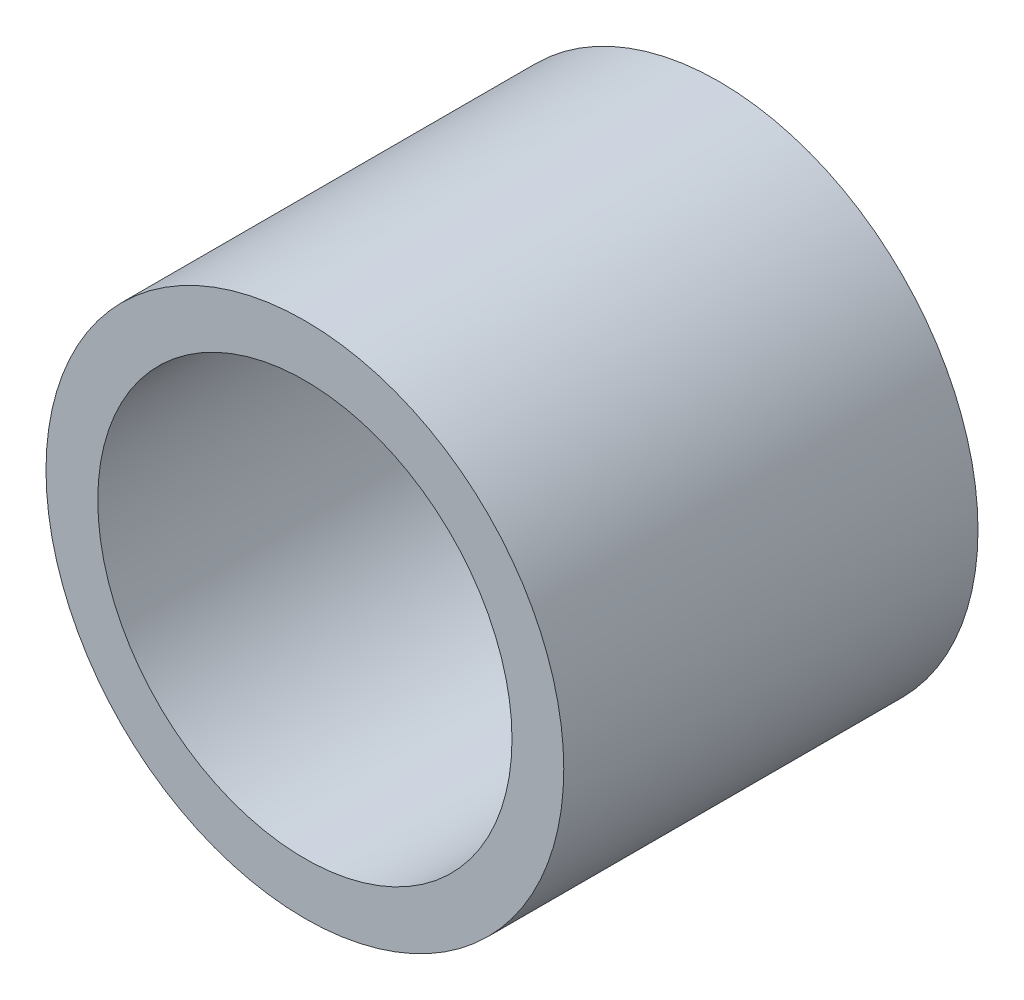
ISO-10303-21;
HEADER;
FILE_DESCRIPTION(('STEP AP214'),'2;1');
FILE_NAME('part.step','',(''),(''),'','','');
FILE_SCHEMA(('AUTOMOTIVE_DESIGN { 1 0 10303 214 1 1 1 1 }'));
ENDSEC;
DATA;
#1=APPLICATION_CONTEXT('core data for automotive mechanical design processes');
#2=APPLICATION_PROTOCOL_DEFINITION('international standard','automotive_design',2000,#1);
#3=PRODUCT_CONTEXT('',#1,'mechanical');
#4=PRODUCT('Part','Part','',(#3));
#5=PRODUCT_RELATED_PRODUCT_CATEGORY('part','',(#4));
#6=PRODUCT_DEFINITION_FORMATION('','',#4);
#7=PRODUCT_DEFINITION_CONTEXT('part definition',#1,'design');
#8=PRODUCT_DEFINITION('design','',#6,#7);
#9=PRODUCT_DEFINITION_SHAPE('','',#8);
#10=(LENGTH_UNIT() NAMED_UNIT(*) SI_UNIT(.MILLI.,.METRE.));
#11=(NAMED_UNIT(*) PLANE_ANGLE_UNIT() SI_UNIT($,.RADIAN.));
#12=(NAMED_UNIT(*) SI_UNIT($,.STERADIAN.) SOLID_ANGLE_UNIT());
#13=UNCERTAINTY_MEASURE_WITH_UNIT(LENGTH_MEASURE(1.E-05),#10,'distance_accuracy_value','');
#14=(GEOMETRIC_REPRESENTATION_CONTEXT(3) GLOBAL_UNCERTAINTY_ASSIGNED_CONTEXT((#13)) GLOBAL_UNIT_ASSIGNED_CONTEXT((#10,
#11,#12)) REPRESENTATION_CONTEXT('',''));
#15=CARTESIAN_POINT('',(0.,0.,0.));
#16=DIRECTION('',(0.,0.,1.));
#17=DIRECTION('',(1.,0.,0.));
#18=AXIS2_PLACEMENT_3D('',#15,#16,#17);
#19=CARTESIAN_POINT('',(1.58380385520257E-13,63.6713610367749,12.));
#20=DIRECTION('',(0.,0.,1.));
#21=DIRECTION('',(1.,0.,0.));
#22=AXIS2_PLACEMENT_3D('',#19,#20,#21);
#23=PLANE('',#22);
#24=CARTESIAN_POINT('',(1.58380385520257E-13,63.6713610367749,12.));
#25=DIRECTION('',(0.,0.,1.));
#26=DIRECTION('',(1.,0.,0.));
#27=AXIS2_PLACEMENT_3D('',#24,#25,#26);
#28=CIRCLE('',#27,7.49999999999987);
#29=CARTESIAN_POINT('',(7.50000000000003,63.6713610367749,12.));
#30=VERTEX_POINT('',#29);
#31=EDGE_CURVE('E10',#30,#30,#28,.T.);
#32=ORIENTED_EDGE('',*,*,#31,.T.);
#33=EDGE_LOOP('',(#32));
#34=FACE_BOUND('',#33,.T.);
#35=CARTESIAN_POINT('',(1.58380385520257E-13,63.6713610367749,12.));
#36=DIRECTION('',(0.,0.,1.));
#37=DIRECTION('',(1.,0.,0.));
#38=AXIS2_PLACEMENT_3D('',#35,#36,#37);
#39=CIRCLE('',#38,5.9999999999998);
#40=CARTESIAN_POINT('',(5.99999999999995,63.6713610367749,12.));
#41=VERTEX_POINT('',#40);
#42=EDGE_CURVE('E44',#41,#41,#39,.T.);
#43=ORIENTED_EDGE('',*,*,#42,.F.);
#44=EDGE_LOOP('',(#43));
#45=FACE_BOUND('',#44,.T.);
#46=ADVANCED_FACE('F33',(#34,#45),#23,.T.);
#47=CARTESIAN_POINT('',(1.58380385520257E-13,63.6713610367749,0.));
#48=DIRECTION('',(0.,0.,1.));
#49=DIRECTION('',(1.,0.,0.));
#50=AXIS2_PLACEMENT_3D('',#47,#48,#49);
#51=PLANE('',#50);
#52=CARTESIAN_POINT('',(1.58380385520257E-13,63.6713610367749,0.));
#53=DIRECTION('',(0.,0.,1.));
#54=DIRECTION('',(1.,0.,0.));
#55=AXIS2_PLACEMENT_3D('',#52,#53,#54);
#56=CIRCLE('',#55,7.49999999999987);
#57=CARTESIAN_POINT('',(7.50000000000003,63.6713610367749,0.));
#58=VERTEX_POINT('',#57);
#59=EDGE_CURVE('E40',#58,#58,#56,.T.);
#60=ORIENTED_EDGE('',*,*,#59,.F.);
#61=EDGE_LOOP('',(#60));
#62=FACE_BOUND('',#61,.T.);
#63=CARTESIAN_POINT('',(1.58380385520257E-13,63.6713610367749,0.));
#64=DIRECTION('',(0.,0.,1.));
#65=DIRECTION('',(1.,0.,0.));
#66=AXIS2_PLACEMENT_3D('',#63,#64,#65);
#67=CIRCLE('',#66,5.9999999999998);
#68=CARTESIAN_POINT('',(5.99999999999995,63.6713610367749,0.));
#69=VERTEX_POINT('',#68);
#70=EDGE_CURVE('E48',#69,#69,#67,.T.);
#71=ORIENTED_EDGE('',*,*,#70,.T.);
#72=EDGE_LOOP('',(#71));
#73=FACE_BOUND('',#72,.T.);
#74=ADVANCED_FACE('F54',(#62,#73),#51,.F.);
#75=CARTESIAN_POINT('',(1.58380385520257E-13,63.6713610367749,12.));
#76=DIRECTION('',(0.,0.,-1.));
#77=DIRECTION('',(-1.,0.,0.));
#78=AXIS2_PLACEMENT_3D('',#75,#76,#77);
#79=CYLINDRICAL_SURFACE('',#78,7.49999999999987);
#80=ORIENTED_EDGE('',*,*,#31,.F.);
#81=EDGE_LOOP('',(#80));
#82=FACE_BOUND('',#81,.T.);
#83=ORIENTED_EDGE('',*,*,#59,.T.);
#84=EDGE_LOOP('',(#83));
#85=FACE_BOUND('',#84,.T.);
#86=ADVANCED_FACE('F35',(#82,#85),#79,.T.);
#87=CARTESIAN_POINT('',(1.58380385520257E-13,63.6713610367749,12.));
#88=DIRECTION('',(0.,0.,-1.));
#89=DIRECTION('',(-1.,0.,0.));
#90=AXIS2_PLACEMENT_3D('',#87,#88,#89);
#91=CYLINDRICAL_SURFACE('',#90,5.9999999999998);
#92=ORIENTED_EDGE('',*,*,#42,.T.);
#93=EDGE_LOOP('',(#92));
#94=FACE_BOUND('',#93,.T.);
#95=ORIENTED_EDGE('',*,*,#70,.F.);
#96=EDGE_LOOP('',(#95));
#97=FACE_BOUND('',#96,.T.);
#98=ADVANCED_FACE('F56',(#94,#97),#91,.F.);
#99=CLOSED_SHELL('',(#46,#74,#86,#98));
#100=MANIFOLD_SOLID_BREP('B2',#99);
#101=ADVANCED_BREP_SHAPE_REPRESENTATION('',(#18,#100),#14);
#102=SHAPE_DEFINITION_REPRESENTATION(#9,#101);
ENDSEC;
END-ISO-10303-21;
